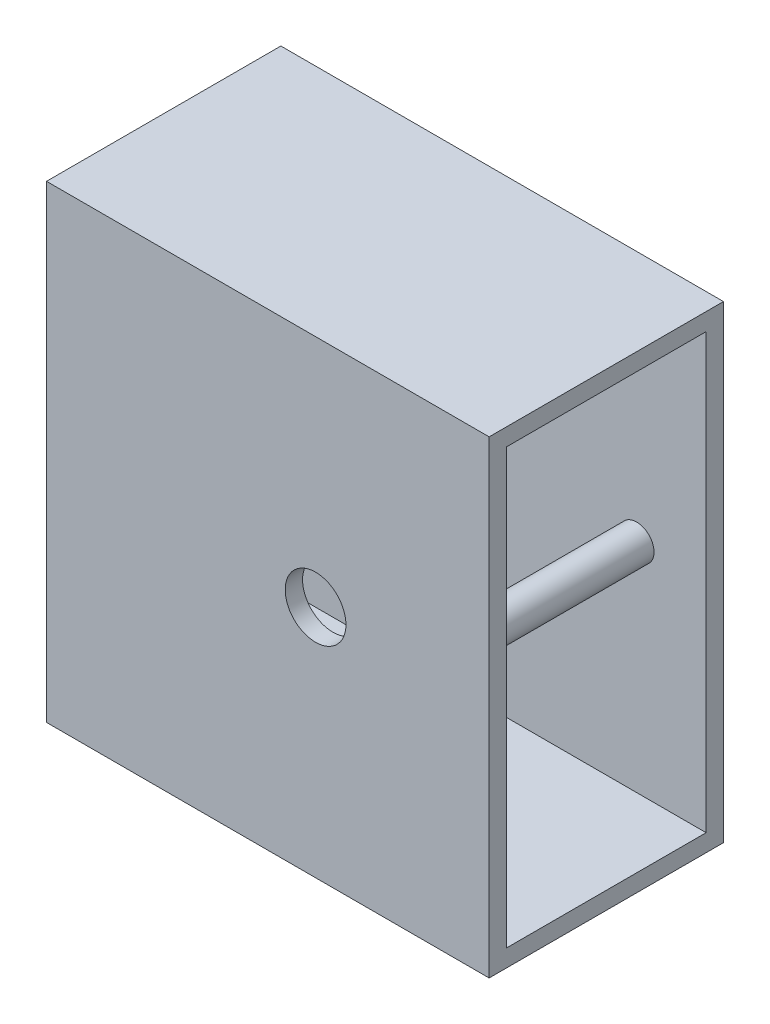
ISO-10303-21;
HEADER;
FILE_DESCRIPTION(('STEP AP214'),'2;1');
FILE_NAME('part.step','',(''),(''),'','','');
FILE_SCHEMA(('AUTOMOTIVE_DESIGN { 1 0 10303 214 1 1 1 1 }'));
ENDSEC;
DATA;
#1=APPLICATION_CONTEXT('core data for automotive mechanical design processes');
#2=APPLICATION_PROTOCOL_DEFINITION('international standard','automotive_design',2000,#1);
#3=PRODUCT_CONTEXT('',#1,'mechanical');
#4=PRODUCT('Part','Part','',(#3));
#5=PRODUCT_RELATED_PRODUCT_CATEGORY('part','',(#4));
#6=PRODUCT_DEFINITION_FORMATION('','',#4);
#7=PRODUCT_DEFINITION_CONTEXT('part definition',#1,'design');
#8=PRODUCT_DEFINITION('design','',#6,#7);
#9=PRODUCT_DEFINITION_SHAPE('','',#8);
#10=(LENGTH_UNIT() NAMED_UNIT(*) SI_UNIT(.MILLI.,.METRE.));
#11=(NAMED_UNIT(*) PLANE_ANGLE_UNIT() SI_UNIT($,.RADIAN.));
#12=(NAMED_UNIT(*) SI_UNIT($,.STERADIAN.) SOLID_ANGLE_UNIT());
#13=UNCERTAINTY_MEASURE_WITH_UNIT(LENGTH_MEASURE(1.E-05),#10,'distance_accuracy_value','');
#14=(GEOMETRIC_REPRESENTATION_CONTEXT(3) GLOBAL_UNCERTAINTY_ASSIGNED_CONTEXT((#13)) GLOBAL_UNIT_ASSIGNED_CONTEXT((#10,
#11,#12)) REPRESENTATION_CONTEXT('',''));
#15=CARTESIAN_POINT('',(0.,0.,0.));
#16=DIRECTION('',(0.,0.,1.));
#17=DIRECTION('',(1.,0.,0.));
#18=AXIS2_PLACEMENT_3D('',#15,#16,#17);
#19=CARTESIAN_POINT('',(50.,0.,0.));
#20=DIRECTION('',(-1.,0.,0.));
#21=DIRECTION('',(0.,0.,1.));
#22=AXIS2_PLACEMENT_3D('',#19,#20,#21);
#23=PLANE('',#22);
#24=DIRECTION('',(0.,1.,0.));
#25=VECTOR('',#24,1.);
#26=CARTESIAN_POINT('',(50.,-27.,-13.5));
#27=LINE('',#26,#25);
#28=CARTESIAN_POINT('',(50.,-27.,-13.5));
#29=VERTEX_POINT('',#28);
#30=CARTESIAN_POINT('',(50.,27.,-13.5));
#31=VERTEX_POINT('',#30);
#32=EDGE_CURVE('E160',#29,#31,#27,.T.);
#33=ORIENTED_EDGE('',*,*,#32,.T.);
#34=DIRECTION('',(0.,0.,1.));
#35=VECTOR('',#34,1.);
#36=CARTESIAN_POINT('',(50.,27.,13.5));
#37=LINE('',#36,#35);
#38=CARTESIAN_POINT('',(50.,27.,13.5));
#39=VERTEX_POINT('',#38);
#40=EDGE_CURVE('E108',#31,#39,#37,.T.);
#41=ORIENTED_EDGE('',*,*,#40,.T.);
#42=DIRECTION('',(0.,-1.,0.));
#43=VECTOR('',#42,1.);
#44=CARTESIAN_POINT('',(50.,-27.,13.5));
#45=LINE('',#44,#43);
#46=CARTESIAN_POINT('',(50.,-27.,13.5));
#47=VERTEX_POINT('',#46);
#48=EDGE_CURVE('E163',#39,#47,#45,.T.);
#49=ORIENTED_EDGE('',*,*,#48,.T.);
#50=DIRECTION('',(0.,0.,-1.));
#51=VECTOR('',#50,1.);
#52=CARTESIAN_POINT('',(50.,-27.,13.5));
#53=LINE('',#52,#51);
#54=EDGE_CURVE('E165',#47,#29,#53,.T.);
#55=ORIENTED_EDGE('',*,*,#54,.T.);
#56=EDGE_LOOP('',(#33,#41,#49,#55));
#57=FACE_BOUND('',#56,.T.);
#58=DIRECTION('',(0.,1.,0.));
#59=VECTOR('',#58,1.);
#60=CARTESIAN_POINT('',(50.,-25.,-11.5));
#61=LINE('',#60,#59);
#62=CARTESIAN_POINT('',(50.,-25.,-11.5));
#63=VERTEX_POINT('',#62);
#64=CARTESIAN_POINT('',(50.,25.,-11.5));
#65=VERTEX_POINT('',#64);
#66=EDGE_CURVE('E135',#63,#65,#61,.T.);
#67=ORIENTED_EDGE('',*,*,#66,.F.);
#68=DIRECTION('',(0.,0.,-1.));
#69=VECTOR('',#68,1.);
#70=CARTESIAN_POINT('',(50.,-25.,11.5));
#71=LINE('',#70,#69);
#72=CARTESIAN_POINT('',(50.,-25.,11.5));
#73=VERTEX_POINT('',#72);
#74=EDGE_CURVE('E142',#73,#63,#71,.T.);
#75=ORIENTED_EDGE('',*,*,#74,.F.);
#76=DIRECTION('',(0.,-1.,0.));
#77=VECTOR('',#76,1.);
#78=CARTESIAN_POINT('',(50.,-25.,11.5));
#79=LINE('',#78,#77);
#80=CARTESIAN_POINT('',(50.,25.,11.5));
#81=VERTEX_POINT('',#80);
#82=EDGE_CURVE('E140',#81,#73,#79,.T.);
#83=ORIENTED_EDGE('',*,*,#82,.F.);
#84=DIRECTION('',(0.,0.,1.));
#85=VECTOR('',#84,1.);
#86=CARTESIAN_POINT('',(50.,25.,11.5));
#87=LINE('',#86,#85);
#88=EDGE_CURVE('E137',#65,#81,#87,.T.);
#89=ORIENTED_EDGE('',*,*,#88,.F.);
#90=EDGE_LOOP('',(#67,#75,#83,#89));
#91=FACE_BOUND('',#90,.T.);
#92=ADVANCED_FACE('F35',(#57,#91),#23,.F.);
#93=CARTESIAN_POINT('',(50.,-27.,-13.5));
#94=DIRECTION('',(0.,0.,1.));
#95=DIRECTION('',(1.,0.,0.));
#96=AXIS2_PLACEMENT_3D('',#93,#94,#95);
#97=PLANE('',#96);
#98=DIRECTION('',(-1.,0.,0.));
#99=VECTOR('',#98,1.);
#100=CARTESIAN_POINT('',(50.,-27.,-13.5));
#101=LINE('',#100,#99);
#102=CARTESIAN_POINT('',(-1.,-27.,-13.5));
#103=VERTEX_POINT('',#102);
#104=EDGE_CURVE('E117',#29,#103,#101,.T.);
#105=ORIENTED_EDGE('',*,*,#104,.T.);
#106=DIRECTION('',(0.,-1.,0.));
#107=VECTOR('',#106,1.);
#108=CARTESIAN_POINT('',(-1.,27.,-13.5));
#109=LINE('',#108,#107);
#110=CARTESIAN_POINT('',(-1.,27.,-13.5));
#111=VERTEX_POINT('',#110);
#112=EDGE_CURVE('E115',#111,#103,#109,.T.);
#113=ORIENTED_EDGE('',*,*,#112,.F.);
#114=DIRECTION('',(-1.,0.,0.));
#115=VECTOR('',#114,1.);
#116=CARTESIAN_POINT('',(50.,27.,-13.5));
#117=LINE('',#116,#115);
#118=EDGE_CURVE('E102',#31,#111,#117,.T.);
#119=ORIENTED_EDGE('',*,*,#118,.F.);
#120=ORIENTED_EDGE('',*,*,#32,.F.);
#121=EDGE_LOOP('',(#105,#113,#119,#120));
#122=FACE_BOUND('',#121,.T.);
#123=ADVANCED_FACE('F37',(#122),#97,.F.);
#124=CARTESIAN_POINT('',(50.,27.,13.5));
#125=DIRECTION('',(0.,-1.,0.));
#126=DIRECTION('',(0.,0.,-1.));
#127=AXIS2_PLACEMENT_3D('',#124,#125,#126);
#128=PLANE('',#127);
#129=ORIENTED_EDGE('',*,*,#118,.T.);
#130=DIRECTION('',(0.,0.,-1.));
#131=VECTOR('',#130,1.);
#132=CARTESIAN_POINT('',(-1.,27.,13.5));
#133=LINE('',#132,#131);
#134=CARTESIAN_POINT('',(-1.,27.,13.5));
#135=VERTEX_POINT('',#134);
#136=EDGE_CURVE('E107',#135,#111,#133,.T.);
#137=ORIENTED_EDGE('',*,*,#136,.F.);
#138=DIRECTION('',(-1.,0.,0.));
#139=VECTOR('',#138,1.);
#140=CARTESIAN_POINT('',(50.,27.,13.5));
#141=LINE('',#140,#139);
#142=EDGE_CURVE('E112',#39,#135,#141,.T.);
#143=ORIENTED_EDGE('',*,*,#142,.F.);
#144=ORIENTED_EDGE('',*,*,#40,.F.);
#145=EDGE_LOOP('',(#129,#137,#143,#144));
#146=FACE_BOUND('',#145,.T.);
#147=ADVANCED_FACE('F104',(#146),#128,.F.);
#148=CARTESIAN_POINT('',(50.,-27.,13.5));
#149=DIRECTION('',(0.,0.,-1.));
#150=DIRECTION('',(-1.,0.,0.));
#151=AXIS2_PLACEMENT_3D('',#148,#149,#150);
#152=PLANE('',#151);
#153=CARTESIAN_POINT('',(30.,0.,13.5));
#154=DIRECTION('',(0.,0.,1.));
#155=DIRECTION('',(1.,0.,0.));
#156=AXIS2_PLACEMENT_3D('',#153,#154,#155);
#157=CIRCLE('',#156,3.5);
#158=CARTESIAN_POINT('',(33.5,0.,13.5));
#159=VERTEX_POINT('',#158);
#160=EDGE_CURVE('E131',#159,#159,#157,.T.);
#161=ORIENTED_EDGE('',*,*,#160,.F.);
#162=EDGE_LOOP('',(#161));
#163=FACE_BOUND('',#162,.T.);
#164=ORIENTED_EDGE('',*,*,#142,.T.);
#165=DIRECTION('',(0.,1.,0.));
#166=VECTOR('',#165,1.);
#167=CARTESIAN_POINT('',(-1.,-27.,13.5));
#168=LINE('',#167,#166);
#169=CARTESIAN_POINT('',(-1.,-27.,13.5));
#170=VERTEX_POINT('',#169);
#171=EDGE_CURVE('E126',#170,#135,#168,.T.);
#172=ORIENTED_EDGE('',*,*,#171,.F.);
#173=DIRECTION('',(-1.,0.,0.));
#174=VECTOR('',#173,1.);
#175=CARTESIAN_POINT('',(50.,-27.,13.5));
#176=LINE('',#175,#174);
#177=EDGE_CURVE('E168',#47,#170,#176,.T.);
#178=ORIENTED_EDGE('',*,*,#177,.F.);
#179=ORIENTED_EDGE('',*,*,#48,.F.);
#180=EDGE_LOOP('',(#164,#172,#178,#179));
#181=FACE_BOUND('',#180,.T.);
#182=ADVANCED_FACE('F218',(#163,#181),#152,.F.);
#183=CARTESIAN_POINT('',(50.,-27.,13.5));
#184=DIRECTION('',(0.,1.,0.));
#185=DIRECTION('',(0.,0.,1.));
#186=AXIS2_PLACEMENT_3D('',#183,#184,#185);
#187=PLANE('',#186);
#188=ORIENTED_EDGE('',*,*,#177,.T.);
#189=DIRECTION('',(0.,0.,1.));
#190=VECTOR('',#189,1.);
#191=CARTESIAN_POINT('',(-1.,-27.,-13.5));
#192=LINE('',#191,#190);
#193=EDGE_CURVE('E121',#103,#170,#192,.T.);
#194=ORIENTED_EDGE('',*,*,#193,.F.);
#195=ORIENTED_EDGE('',*,*,#104,.F.);
#196=ORIENTED_EDGE('',*,*,#54,.F.);
#197=EDGE_LOOP('',(#188,#194,#195,#196));
#198=FACE_BOUND('',#197,.T.);
#199=ADVANCED_FACE('F215',(#198),#187,.F.);
#200=CARTESIAN_POINT('',(50.,-25.,-11.5));
#201=DIRECTION('',(0.,0.,1.));
#202=DIRECTION('',(1.,0.,0.));
#203=AXIS2_PLACEMENT_3D('',#200,#201,#202);
#204=PLANE('',#203);
#205=CARTESIAN_POINT('',(42.,0.,-11.5));
#206=DIRECTION('',(0.,0.,1.));
#207=DIRECTION('',(1.,0.,0.));
#208=AXIS2_PLACEMENT_3D('',#205,#206,#207);
#209=CIRCLE('',#208,2.);
#210=CARTESIAN_POINT('',(44.,0.,-11.5));
#211=VERTEX_POINT('',#210);
#212=EDGE_CURVE('E11',#211,#211,#209,.T.);
#213=ORIENTED_EDGE('',*,*,#212,.F.);
#214=EDGE_LOOP('',(#213));
#215=FACE_BOUND('',#214,.T.);
#216=DIRECTION('',(0.,1.,0.));
#217=VECTOR('',#216,1.);
#218=CARTESIAN_POINT('',(0.,-25.,-11.5));
#219=LINE('',#218,#217);
#220=CARTESIAN_POINT('',(0.,-25.,-11.5));
#221=VERTEX_POINT('',#220);
#222=CARTESIAN_POINT('',(0.,25.,-11.5));
#223=VERTEX_POINT('',#222);
#224=EDGE_CURVE('E58',#221,#223,#219,.T.);
#225=ORIENTED_EDGE('',*,*,#224,.F.);
#226=DIRECTION('',(-1.,0.,0.));
#227=VECTOR('',#226,1.);
#228=CARTESIAN_POINT('',(50.,-25.,-11.5));
#229=LINE('',#228,#227);
#230=EDGE_CURVE('E144',#63,#221,#229,.T.);
#231=ORIENTED_EDGE('',*,*,#230,.F.);
#232=ORIENTED_EDGE('',*,*,#66,.T.);
#233=DIRECTION('',(-1.,0.,0.));
#234=VECTOR('',#233,1.);
#235=CARTESIAN_POINT('',(50.,25.,-11.5));
#236=LINE('',#235,#234);
#237=EDGE_CURVE('E158',#65,#223,#236,.T.);
#238=ORIENTED_EDGE('',*,*,#237,.T.);
#239=EDGE_LOOP('',(#225,#231,#232,#238));
#240=FACE_BOUND('',#239,.T.);
#241=ADVANCED_FACE('F194',(#215,#240),#204,.T.);
#242=CARTESIAN_POINT('',(50.,25.,11.5));
#243=DIRECTION('',(0.,-1.,0.));
#244=DIRECTION('',(0.,0.,-1.));
#245=AXIS2_PLACEMENT_3D('',#242,#243,#244);
#246=PLANE('',#245);
#247=DIRECTION('',(0.,0.,1.));
#248=VECTOR('',#247,1.);
#249=CARTESIAN_POINT('',(0.,25.,11.5));
#250=LINE('',#249,#248);
#251=CARTESIAN_POINT('',(0.,25.,11.5));
#252=VERTEX_POINT('',#251);
#253=EDGE_CURVE('E146',#223,#252,#250,.T.);
#254=ORIENTED_EDGE('',*,*,#253,.F.);
#255=ORIENTED_EDGE('',*,*,#237,.F.);
#256=ORIENTED_EDGE('',*,*,#88,.T.);
#257=DIRECTION('',(-1.,0.,0.));
#258=VECTOR('',#257,1.);
#259=CARTESIAN_POINT('',(50.,25.,11.5));
#260=LINE('',#259,#258);
#261=EDGE_CURVE('E156',#81,#252,#260,.T.);
#262=ORIENTED_EDGE('',*,*,#261,.T.);
#263=EDGE_LOOP('',(#254,#255,#256,#262));
#264=FACE_BOUND('',#263,.T.);
#265=ADVANCED_FACE('F182',(#264),#246,.T.);
#266=CARTESIAN_POINT('',(50.,-25.,11.5));
#267=DIRECTION('',(0.,0.,-1.));
#268=DIRECTION('',(-1.,0.,0.));
#269=AXIS2_PLACEMENT_3D('',#266,#267,#268);
#270=PLANE('',#269);
#271=CARTESIAN_POINT('',(42.,0.,11.5));
#272=DIRECTION('',(0.,0.,-1.));
#273=DIRECTION('',(-1.,0.,0.));
#274=AXIS2_PLACEMENT_3D('',#271,#272,#273);
#275=CIRCLE('',#274,2.);
#276=CARTESIAN_POINT('',(40.,0.,11.5));
#277=VERTEX_POINT('',#276);
#278=EDGE_CURVE('E43',#277,#277,#275,.T.);
#279=ORIENTED_EDGE('',*,*,#278,.F.);
#280=EDGE_LOOP('',(#279));
#281=FACE_BOUND('',#280,.T.);
#282=CARTESIAN_POINT('',(30.,0.,11.5));
#283=DIRECTION('',(0.,0.,-1.));
#284=DIRECTION('',(-1.,0.,0.));
#285=AXIS2_PLACEMENT_3D('',#282,#283,#284);
#286=CIRCLE('',#285,3.5);
#287=CARTESIAN_POINT('',(26.5,0.,11.5));
#288=VERTEX_POINT('',#287);
#289=EDGE_CURVE('E134',#288,#288,#286,.T.);
#290=ORIENTED_EDGE('',*,*,#289,.F.);
#291=EDGE_LOOP('',(#290));
#292=FACE_BOUND('',#291,.T.);
#293=DIRECTION('',(0.,-1.,0.));
#294=VECTOR('',#293,1.);
#295=CARTESIAN_POINT('',(0.,-25.,11.5));
#296=LINE('',#295,#294);
#297=CARTESIAN_POINT('',(0.,-25.,11.5));
#298=VERTEX_POINT('',#297);
#299=EDGE_CURVE('E149',#252,#298,#296,.T.);
#300=ORIENTED_EDGE('',*,*,#299,.F.);
#301=ORIENTED_EDGE('',*,*,#261,.F.);
#302=ORIENTED_EDGE('',*,*,#82,.T.);
#303=DIRECTION('',(-1.,0.,0.));
#304=VECTOR('',#303,1.);
#305=CARTESIAN_POINT('',(50.,-25.,11.5));
#306=LINE('',#305,#304);
#307=EDGE_CURVE('E50',#73,#298,#306,.T.);
#308=ORIENTED_EDGE('',*,*,#307,.T.);
#309=EDGE_LOOP('',(#300,#301,#302,#308));
#310=FACE_BOUND('',#309,.T.);
#311=ADVANCED_FACE('F178',(#281,#292,#310),#270,.T.);
#312=CARTESIAN_POINT('',(50.,-25.,11.5));
#313=DIRECTION('',(0.,1.,0.));
#314=DIRECTION('',(0.,0.,1.));
#315=AXIS2_PLACEMENT_3D('',#312,#313,#314);
#316=PLANE('',#315);
#317=DIRECTION('',(0.,0.,-1.));
#318=VECTOR('',#317,1.);
#319=CARTESIAN_POINT('',(0.,-25.,11.5));
#320=LINE('',#319,#318);
#321=EDGE_CURVE('E138',#298,#221,#320,.T.);
#322=ORIENTED_EDGE('',*,*,#321,.F.);
#323=ORIENTED_EDGE('',*,*,#307,.F.);
#324=ORIENTED_EDGE('',*,*,#74,.T.);
#325=ORIENTED_EDGE('',*,*,#230,.T.);
#326=EDGE_LOOP('',(#322,#323,#324,#325));
#327=FACE_BOUND('',#326,.T.);
#328=ADVANCED_FACE('F181',(#327),#316,.T.);
#329=CARTESIAN_POINT('',(30.,0.,8.50000000000001));
#330=DIRECTION('',(0.,0.,1.));
#331=DIRECTION('',(1.,0.,0.));
#332=AXIS2_PLACEMENT_3D('',#329,#330,#331);
#333=CYLINDRICAL_SURFACE('',#332,3.5);
#334=ORIENTED_EDGE('',*,*,#289,.T.);
#335=EDGE_LOOP('',(#334));
#336=FACE_BOUND('',#335,.T.);
#337=ORIENTED_EDGE('',*,*,#160,.T.);
#338=EDGE_LOOP('',(#337));
#339=FACE_BOUND('',#338,.T.);
#340=ADVANCED_FACE('F199',(#336,#339),#333,.F.);
#341=CARTESIAN_POINT('',(42.,0.,-11.5));
#342=DIRECTION('',(0.,0.,1.));
#343=DIRECTION('',(1.,0.,0.));
#344=AXIS2_PLACEMENT_3D('',#341,#342,#343);
#345=CYLINDRICAL_SURFACE('',#344,2.);
#346=ORIENTED_EDGE('',*,*,#278,.T.);
#347=EDGE_LOOP('',(#346));
#348=FACE_BOUND('',#347,.T.);
#349=ORIENTED_EDGE('',*,*,#212,.T.);
#350=EDGE_LOOP('',(#349));
#351=FACE_BOUND('',#350,.T.);
#352=ADVANCED_FACE('F175',(#348,#351),#345,.T.);
#353=CARTESIAN_POINT('',(0.,0.,0.));
#354=DIRECTION('',(-1.,0.,0.));
#355=DIRECTION('',(0.,0.,1.));
#356=AXIS2_PLACEMENT_3D('',#353,#354,#355);
#357=PLANE('',#356);
#358=ORIENTED_EDGE('',*,*,#299,.T.);
#359=ORIENTED_EDGE('',*,*,#321,.T.);
#360=ORIENTED_EDGE('',*,*,#224,.T.);
#361=ORIENTED_EDGE('',*,*,#253,.T.);
#362=EDGE_LOOP('',(#358,#359,#360,#361));
#363=FACE_BOUND('',#362,.T.);
#364=ADVANCED_FACE('F190',(#363),#357,.F.);
#365=CARTESIAN_POINT('',(-1.,0.,0.));
#366=DIRECTION('',(-1.,0.,0.));
#367=DIRECTION('',(0.,0.,1.));
#368=AXIS2_PLACEMENT_3D('',#365,#366,#367);
#369=PLANE('',#368);
#370=ORIENTED_EDGE('',*,*,#136,.T.);
#371=ORIENTED_EDGE('',*,*,#112,.T.);
#372=ORIENTED_EDGE('',*,*,#193,.T.);
#373=ORIENTED_EDGE('',*,*,#171,.T.);
#374=EDGE_LOOP('',(#370,#371,#372,#373));
#375=FACE_BOUND('',#374,.T.);
#376=ADVANCED_FACE('F124',(#375),#369,.T.);
#377=CLOSED_SHELL('',(#92,#123,#147,#182,#199,#241,#265,#311,#328,#340,#352,#364,#376));
#378=MANIFOLD_SOLID_BREP('B2',#377);
#379=ADVANCED_BREP_SHAPE_REPRESENTATION('',(#18,#378),#14);
#380=SHAPE_DEFINITION_REPRESENTATION(#9,#379);
ENDSEC;
END-ISO-10303-21;
